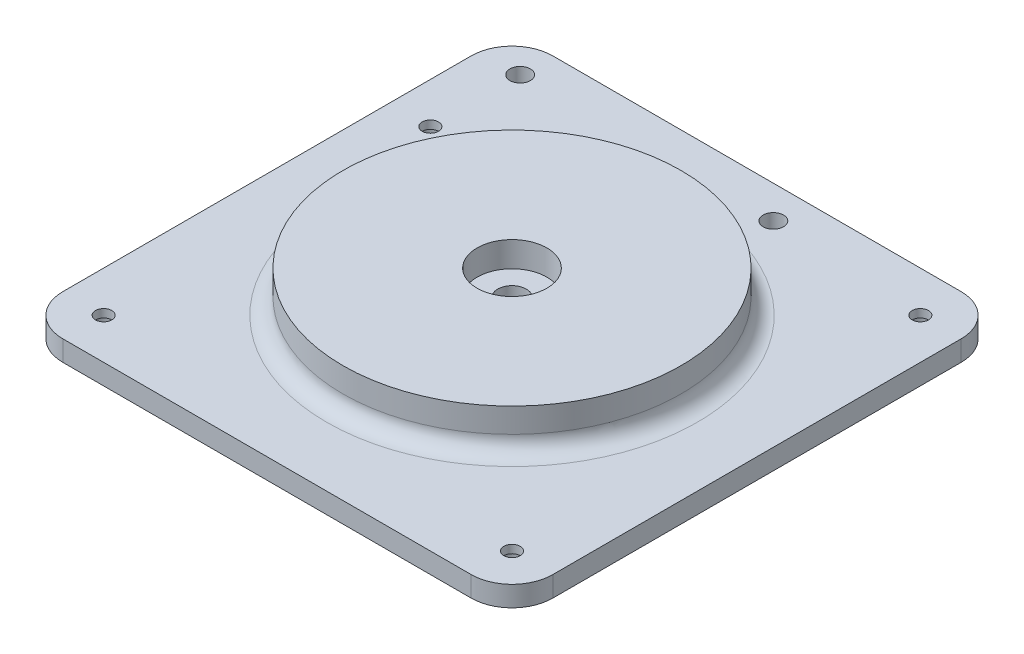
ISO-10303-21;
HEADER;
FILE_DESCRIPTION(('STEP AP214'),'2;1');
FILE_NAME('part.step','',(''),(''),'','','');
FILE_SCHEMA(('AUTOMOTIVE_DESIGN { 1 0 10303 214 1 1 1 1 }'));
ENDSEC;
DATA;
#1=APPLICATION_CONTEXT('core data for automotive mechanical design processes');
#2=APPLICATION_PROTOCOL_DEFINITION('international standard','automotive_design',2000,#1);
#3=PRODUCT_CONTEXT('',#1,'mechanical');
#4=PRODUCT('Part','Part','',(#3));
#5=PRODUCT_RELATED_PRODUCT_CATEGORY('part','',(#4));
#6=PRODUCT_DEFINITION_FORMATION('','',#4);
#7=PRODUCT_DEFINITION_CONTEXT('part definition',#1,'design');
#8=PRODUCT_DEFINITION('design','',#6,#7);
#9=PRODUCT_DEFINITION_SHAPE('','',#8);
#10=(LENGTH_UNIT() NAMED_UNIT(*) SI_UNIT(.MILLI.,.METRE.));
#11=(NAMED_UNIT(*) PLANE_ANGLE_UNIT() SI_UNIT($,.RADIAN.));
#12=(NAMED_UNIT(*) SI_UNIT($,.STERADIAN.) SOLID_ANGLE_UNIT());
#13=UNCERTAINTY_MEASURE_WITH_UNIT(LENGTH_MEASURE(1.E-05),#10,'distance_accuracy_value','');
#14=(GEOMETRIC_REPRESENTATION_CONTEXT(3) GLOBAL_UNCERTAINTY_ASSIGNED_CONTEXT((#13)) GLOBAL_UNIT_ASSIGNED_CONTEXT((#10,
#11,#12)) REPRESENTATION_CONTEXT('',''));
#15=CARTESIAN_POINT('',(0.,0.,0.));
#16=DIRECTION('',(0.,0.,1.));
#17=DIRECTION('',(1.,0.,0.));
#18=AXIS2_PLACEMENT_3D('',#15,#16,#17);
#19=CARTESIAN_POINT('',(0.,-5.,0.));
#20=DIRECTION('',(0.,1.,0.));
#21=DIRECTION('',(0.,0.,1.));
#22=AXIS2_PLACEMENT_3D('',#19,#20,#21);
#23=CYLINDRICAL_SURFACE('',#22,3.5);
#24=CARTESIAN_POINT('',(0.,1.,0.));
#25=DIRECTION('',(0.,-1.,0.));
#26=DIRECTION('',(0.,0.,-1.));
#27=AXIS2_PLACEMENT_3D('',#24,#25,#26);
#28=CIRCLE('',#27,3.5);
#29=CARTESIAN_POINT('',(0.,1.,-3.5));
#30=VERTEX_POINT('',#29);
#31=EDGE_CURVE('E179',#30,#30,#28,.F.);
#32=ORIENTED_EDGE('',*,*,#31,.F.);
#33=EDGE_LOOP('',(#32));
#34=FACE_BOUND('',#33,.T.);
#35=CARTESIAN_POINT('',(0.,3.8,0.));
#36=DIRECTION('',(0.,1.,0.));
#37=DIRECTION('',(0.,0.,1.));
#38=AXIS2_PLACEMENT_3D('',#35,#36,#37);
#39=CIRCLE('',#38,3.5);
#40=CARTESIAN_POINT('',(0.,3.8,3.5));
#41=VERTEX_POINT('',#40);
#42=EDGE_CURVE('E40',#41,#41,#39,.F.);
#43=ORIENTED_EDGE('',*,*,#42,.F.);
#44=EDGE_LOOP('',(#43));
#45=FACE_BOUND('',#44,.T.);
#46=ADVANCED_FACE('F36',(#34,#45),#23,.F.);
#47=CARTESIAN_POINT('',(50.,-5.,50.));
#48=DIRECTION('',(0.,1.,0.));
#49=DIRECTION('',(0.,0.,1.));
#50=AXIS2_PLACEMENT_3D('',#47,#48,#49);
#51=CYLINDRICAL_SURFACE('',#50,10.);
#52=DIRECTION('',(0.,1.,0.));
#53=VECTOR('',#52,1.);
#54=CARTESIAN_POINT('',(50.,-5.,60.));
#55=LINE('',#54,#53);
#56=CARTESIAN_POINT('',(50.,-5.,60.));
#57=VERTEX_POINT('',#56);
#58=CARTESIAN_POINT('',(50.,0.,60.));
#59=VERTEX_POINT('',#58);
#60=EDGE_CURVE('E158',#57,#59,#55,.T.);
#61=ORIENTED_EDGE('',*,*,#60,.F.);
#62=CARTESIAN_POINT('',(50.,-5.,50.));
#63=DIRECTION('',(0.,-1.,0.));
#64=DIRECTION('',(0.,0.,-1.));
#65=AXIS2_PLACEMENT_3D('',#62,#63,#64);
#66=CIRCLE('',#65,10.);
#67=CARTESIAN_POINT('',(60.,-5.,50.));
#68=VERTEX_POINT('',#67);
#69=EDGE_CURVE('E45',#68,#57,#66,.T.);
#70=ORIENTED_EDGE('',*,*,#69,.F.);
#71=DIRECTION('',(0.,1.,0.));
#72=VECTOR('',#71,1.);
#73=CARTESIAN_POINT('',(60.,-5.,50.));
#74=LINE('',#73,#72);
#75=CARTESIAN_POINT('',(60.,0.,50.));
#76=VERTEX_POINT('',#75);
#77=EDGE_CURVE('E161',#76,#68,#74,.F.);
#78=ORIENTED_EDGE('',*,*,#77,.F.);
#79=CARTESIAN_POINT('',(50.,0.,50.));
#80=DIRECTION('',(0.,-1.,0.));
#81=DIRECTION('',(0.,0.,-1.));
#82=AXIS2_PLACEMENT_3D('',#79,#80,#81);
#83=CIRCLE('',#82,10.);
#84=EDGE_CURVE('E11',#59,#76,#83,.F.);
#85=ORIENTED_EDGE('',*,*,#84,.F.);
#86=EDGE_LOOP('',(#61,#70,#78,#85));
#87=FACE_BOUND('',#86,.T.);
#88=ADVANCED_FACE('F38',(#87),#51,.T.);
#89=CARTESIAN_POINT('',(-50.,-5.,50.));
#90=DIRECTION('',(0.,1.,0.));
#91=DIRECTION('',(0.,0.,1.));
#92=AXIS2_PLACEMENT_3D('',#89,#90,#91);
#93=CYLINDRICAL_SURFACE('',#92,10.);
#94=DIRECTION('',(0.,1.,0.));
#95=VECTOR('',#94,1.);
#96=CARTESIAN_POINT('',(-60.,-5.,50.));
#97=LINE('',#96,#95);
#98=CARTESIAN_POINT('',(-60.,-5.,50.));
#99=VERTEX_POINT('',#98);
#100=CARTESIAN_POINT('',(-60.,0.,50.));
#101=VERTEX_POINT('',#100);
#102=EDGE_CURVE('E147',#99,#101,#97,.T.);
#103=ORIENTED_EDGE('',*,*,#102,.F.);
#104=CARTESIAN_POINT('',(-50.,-5.,50.));
#105=DIRECTION('',(0.,-1.,0.));
#106=DIRECTION('',(0.,0.,-1.));
#107=AXIS2_PLACEMENT_3D('',#104,#105,#106);
#108=CIRCLE('',#107,10.);
#109=CARTESIAN_POINT('',(-50.,-5.,60.));
#110=VERTEX_POINT('',#109);
#111=EDGE_CURVE('E153',#110,#99,#108,.T.);
#112=ORIENTED_EDGE('',*,*,#111,.F.);
#113=DIRECTION('',(0.,1.,0.));
#114=VECTOR('',#113,1.);
#115=CARTESIAN_POINT('',(-50.,-5.,60.));
#116=LINE('',#115,#114);
#117=CARTESIAN_POINT('',(-50.,0.,60.));
#118=VERTEX_POINT('',#117);
#119=EDGE_CURVE('E150',#118,#110,#116,.F.);
#120=ORIENTED_EDGE('',*,*,#119,.F.);
#121=CARTESIAN_POINT('',(-50.,0.,50.));
#122=DIRECTION('',(0.,-1.,0.));
#123=DIRECTION('',(0.,0.,-1.));
#124=AXIS2_PLACEMENT_3D('',#121,#122,#123);
#125=CIRCLE('',#124,10.);
#126=EDGE_CURVE('E155',#101,#118,#125,.F.);
#127=ORIENTED_EDGE('',*,*,#126,.F.);
#128=EDGE_LOOP('',(#103,#112,#120,#127));
#129=FACE_BOUND('',#128,.T.);
#130=ADVANCED_FACE('F223',(#129),#93,.T.);
#131=CARTESIAN_POINT('',(-50.,-5.,-50.));
#132=DIRECTION('',(0.,1.,0.));
#133=DIRECTION('',(0.,0.,1.));
#134=AXIS2_PLACEMENT_3D('',#131,#132,#133);
#135=CYLINDRICAL_SURFACE('',#134,10.);
#136=DIRECTION('',(0.,1.,0.));
#137=VECTOR('',#136,1.);
#138=CARTESIAN_POINT('',(-50.,-5.,-60.));
#139=LINE('',#138,#137);
#140=CARTESIAN_POINT('',(-50.,-5.,-60.));
#141=VERTEX_POINT('',#140);
#142=CARTESIAN_POINT('',(-50.,0.,-60.));
#143=VERTEX_POINT('',#142);
#144=EDGE_CURVE('E122',#141,#143,#139,.T.);
#145=ORIENTED_EDGE('',*,*,#144,.F.);
#146=CARTESIAN_POINT('',(-50.,-5.,-50.));
#147=DIRECTION('',(0.,-1.,0.));
#148=DIRECTION('',(0.,0.,-1.));
#149=AXIS2_PLACEMENT_3D('',#146,#147,#148);
#150=CIRCLE('',#149,10.);
#151=CARTESIAN_POINT('',(-60.,-5.,-50.));
#152=VERTEX_POINT('',#151);
#153=EDGE_CURVE('E107',#152,#141,#150,.T.);
#154=ORIENTED_EDGE('',*,*,#153,.F.);
#155=DIRECTION('',(0.,1.,0.));
#156=VECTOR('',#155,1.);
#157=CARTESIAN_POINT('',(-60.,-5.,-50.));
#158=LINE('',#157,#156);
#159=CARTESIAN_POINT('',(-60.,0.,-50.));
#160=VERTEX_POINT('',#159);
#161=EDGE_CURVE('E140',#160,#152,#158,.F.);
#162=ORIENTED_EDGE('',*,*,#161,.F.);
#163=CARTESIAN_POINT('',(-50.,0.,-50.));
#164=DIRECTION('',(0.,-1.,0.));
#165=DIRECTION('',(0.,0.,-1.));
#166=AXIS2_PLACEMENT_3D('',#163,#164,#165);
#167=CIRCLE('',#166,10.);
#168=EDGE_CURVE('E144',#143,#160,#167,.F.);
#169=ORIENTED_EDGE('',*,*,#168,.F.);
#170=EDGE_LOOP('',(#145,#154,#162,#169));
#171=FACE_BOUND('',#170,.T.);
#172=ADVANCED_FACE('F425',(#171),#135,.T.);
#173=CARTESIAN_POINT('',(50.,-5.,-50.));
#174=DIRECTION('',(0.,-1.,0.));
#175=DIRECTION('',(0.,0.,-1.));
#176=AXIS2_PLACEMENT_3D('',#173,#174,#175);
#177=CYLINDRICAL_SURFACE('',#176,10.);
#178=DIRECTION('',(0.,-1.,0.));
#179=VECTOR('',#178,1.);
#180=CARTESIAN_POINT('',(50.,-5.,-60.));
#181=LINE('',#180,#179);
#182=CARTESIAN_POINT('',(50.,0.,-60.));
#183=VERTEX_POINT('',#182);
#184=CARTESIAN_POINT('',(50.,-5.,-60.));
#185=VERTEX_POINT('',#184);
#186=EDGE_CURVE('E118',#183,#185,#181,.T.);
#187=ORIENTED_EDGE('',*,*,#186,.F.);
#188=CARTESIAN_POINT('',(50.,0.,-50.));
#189=DIRECTION('',(0.,-1.,0.));
#190=DIRECTION('',(0.,0.,-1.));
#191=AXIS2_PLACEMENT_3D('',#188,#189,#190);
#192=CIRCLE('',#191,10.);
#193=CARTESIAN_POINT('',(60.,0.,-50.));
#194=VERTEX_POINT('',#193);
#195=EDGE_CURVE('E123',#194,#183,#192,.F.);
#196=ORIENTED_EDGE('',*,*,#195,.F.);
#197=DIRECTION('',(0.,-1.,0.));
#198=VECTOR('',#197,1.);
#199=CARTESIAN_POINT('',(60.,-5.,-50.));
#200=LINE('',#199,#198);
#201=CARTESIAN_POINT('',(60.,-5.,-50.));
#202=VERTEX_POINT('',#201);
#203=EDGE_CURVE('E120',#202,#194,#200,.F.);
#204=ORIENTED_EDGE('',*,*,#203,.F.);
#205=CARTESIAN_POINT('',(50.,-5.,-50.));
#206=DIRECTION('',(0.,-1.,0.));
#207=DIRECTION('',(0.,0.,-1.));
#208=AXIS2_PLACEMENT_3D('',#205,#206,#207);
#209=CIRCLE('',#208,10.);
#210=EDGE_CURVE('E104',#185,#202,#209,.T.);
#211=ORIENTED_EDGE('',*,*,#210,.F.);
#212=EDGE_LOOP('',(#187,#196,#204,#211));
#213=FACE_BOUND('',#212,.T.);
#214=ADVANCED_FACE('F117',(#213),#177,.T.);
#215=CARTESIAN_POINT('',(0.,-5.,0.));
#216=DIRECTION('',(0.,-1.,0.));
#217=DIRECTION('',(0.,0.,-1.));
#218=AXIS2_PLACEMENT_3D('',#215,#216,#217);
#219=PLANE('',#218);
#220=DIRECTION('',(0.,0.,1.));
#221=VECTOR('',#220,1.);
#222=CARTESIAN_POINT('',(60.,-5.,60.));
#223=LINE('',#222,#221);
#224=EDGE_CURVE('E166',#202,#68,#223,.T.);
#225=ORIENTED_EDGE('',*,*,#224,.T.);
#226=ORIENTED_EDGE('',*,*,#69,.T.);
#227=DIRECTION('',(-1.,0.,0.));
#228=VECTOR('',#227,1.);
#229=CARTESIAN_POINT('',(-60.,-5.,60.));
#230=LINE('',#229,#228);
#231=EDGE_CURVE('E164',#57,#110,#230,.T.);
#232=ORIENTED_EDGE('',*,*,#231,.T.);
#233=ORIENTED_EDGE('',*,*,#111,.T.);
#234=DIRECTION('',(0.,0.,-1.));
#235=VECTOR('',#234,1.);
#236=CARTESIAN_POINT('',(-60.,-5.,60.));
#237=LINE('',#236,#235);
#238=EDGE_CURVE('E113',#99,#152,#237,.T.);
#239=ORIENTED_EDGE('',*,*,#238,.T.);
#240=ORIENTED_EDGE('',*,*,#153,.T.);
#241=DIRECTION('',(1.,0.,0.));
#242=VECTOR('',#241,1.);
#243=CARTESIAN_POINT('',(-60.,-5.,-60.));
#244=LINE('',#243,#242);
#245=EDGE_CURVE('E99',#141,#185,#244,.T.);
#246=ORIENTED_EDGE('',*,*,#245,.T.);
#247=ORIENTED_EDGE('',*,*,#210,.T.);
#248=EDGE_LOOP('',(#225,#226,#232,#233,#239,#240,#246,#247));
#249=FACE_BOUND('',#248,.T.);
#250=CARTESIAN_POINT('',(-50.,-5.,-30.));
#251=DIRECTION('',(0.,-1.,0.));
#252=DIRECTION('',(0.,0.,-1.));
#253=AXIS2_PLACEMENT_3D('',#250,#251,#252);
#254=CIRCLE('',#253,3.);
#255=CARTESIAN_POINT('',(-50.,-5.,-33.));
#256=VERTEX_POINT('',#255);
#257=EDGE_CURVE('E568',#256,#256,#254,.T.);
#258=ORIENTED_EDGE('',*,*,#257,.F.);
#259=EDGE_LOOP('',(#258));
#260=FACE_BOUND('',#259,.T.);
#261=CARTESIAN_POINT('',(50.,-5.,-50.));
#262=DIRECTION('',(0.,-1.,0.));
#263=DIRECTION('',(0.,0.,-1.));
#264=AXIS2_PLACEMENT_3D('',#261,#262,#263);
#265=CIRCLE('',#264,3.);
#266=CARTESIAN_POINT('',(50.,-5.,-53.));
#267=VERTEX_POINT('',#266);
#268=EDGE_CURVE('E579',#267,#267,#265,.T.);
#269=ORIENTED_EDGE('',*,*,#268,.F.);
#270=EDGE_LOOP('',(#269));
#271=FACE_BOUND('',#270,.T.);
#272=CARTESIAN_POINT('',(50.,-5.,50.));
#273=DIRECTION('',(0.,-1.,0.));
#274=DIRECTION('',(0.,0.,-1.));
#275=AXIS2_PLACEMENT_3D('',#272,#273,#274);
#276=CIRCLE('',#275,3.);
#277=CARTESIAN_POINT('',(50.,-5.,47.));
#278=VERTEX_POINT('',#277);
#279=EDGE_CURVE('E573',#278,#278,#276,.T.);
#280=ORIENTED_EDGE('',*,*,#279,.F.);
#281=EDGE_LOOP('',(#280));
#282=FACE_BOUND('',#281,.T.);
#283=CARTESIAN_POINT('',(-50.,-5.,50.));
#284=DIRECTION('',(0.,-1.,0.));
#285=DIRECTION('',(0.,0.,-1.));
#286=AXIS2_PLACEMENT_3D('',#283,#284,#285);
#287=CIRCLE('',#286,3.);
#288=CARTESIAN_POINT('',(-50.,-5.,47.));
#289=VERTEX_POINT('',#288);
#290=EDGE_CURVE('E572',#289,#289,#287,.T.);
#291=ORIENTED_EDGE('',*,*,#290,.F.);
#292=EDGE_LOOP('',(#291));
#293=FACE_BOUND('',#292,.T.);
#294=CARTESIAN_POINT('',(0.,-5.,0.));
#295=DIRECTION('',(0.,-1.,0.));
#296=DIRECTION('',(0.,0.,-1.));
#297=AXIS2_PLACEMENT_3D('',#294,#295,#296);
#298=CIRCLE('',#297,8.5);
#299=CARTESIAN_POINT('',(0.,-5.,-8.5));
#300=VERTEX_POINT('',#299);
#301=EDGE_CURVE('E590',#300,#300,#298,.T.);
#302=ORIENTED_EDGE('',*,*,#301,.F.);
#303=EDGE_LOOP('',(#302));
#304=FACE_BOUND('',#303,.T.);
#305=CARTESIAN_POINT('',(-50.,-5.,-52.));
#306=DIRECTION('',(0.,1.,0.));
#307=DIRECTION('',(0.,0.,1.));
#308=AXIS2_PLACEMENT_3D('',#305,#306,#307);
#309=CIRCLE('',#308,2.5);
#310=CARTESIAN_POINT('',(-50.,-5.,-49.5));
#311=VERTEX_POINT('',#310);
#312=EDGE_CURVE('E136',#311,#311,#309,.F.);
#313=ORIENTED_EDGE('',*,*,#312,.F.);
#314=EDGE_LOOP('',(#313));
#315=FACE_BOUND('',#314,.T.);
#316=CARTESIAN_POINT('',(12.,-5.,-52.));
#317=DIRECTION('',(0.,1.,0.));
#318=DIRECTION('',(0.,0.,1.));
#319=AXIS2_PLACEMENT_3D('',#316,#317,#318);
#320=CIRCLE('',#319,2.5);
#321=CARTESIAN_POINT('',(12.,-5.,-49.5));
#322=VERTEX_POINT('',#321);
#323=EDGE_CURVE('E535',#322,#322,#320,.F.);
#324=ORIENTED_EDGE('',*,*,#323,.F.);
#325=EDGE_LOOP('',(#324));
#326=FACE_BOUND('',#325,.T.);
#327=ADVANCED_FACE('F102',(#249,#260,#271,#282,#293,#304,#315,#326),#219,.T.);
#328=CARTESIAN_POINT('',(0.,4.,0.));
#329=DIRECTION('',(0.,-1.,0.));
#330=DIRECTION('',(0.,0.,-1.));
#331=AXIS2_PLACEMENT_3D('',#328,#329,#330);
#332=TOROIDAL_SURFACE('',#331,45.4,4.);
#333=CARTESIAN_POINT('',(0.,0.,0.));
#334=DIRECTION('',(0.,-1.,0.));
#335=DIRECTION('',(0.,0.,-1.));
#336=AXIS2_PLACEMENT_3D('',#333,#334,#335);
#337=CIRCLE('',#336,45.4);
#338=CARTESIAN_POINT('',(0.,0.,-45.4));
#339=VERTEX_POINT('',#338);
#340=EDGE_CURVE('E133',#339,#339,#337,.T.);
#341=ORIENTED_EDGE('',*,*,#340,.F.);
#342=EDGE_LOOP('',(#341));
#343=FACE_BOUND('',#342,.T.);
#344=CARTESIAN_POINT('',(0.,4.,0.));
#345=DIRECTION('',(0.,-1.,0.));
#346=DIRECTION('',(0.,0.,-1.));
#347=AXIS2_PLACEMENT_3D('',#344,#345,#346);
#348=CIRCLE('',#347,41.4);
#349=CARTESIAN_POINT('',(0.,4.,-41.4));
#350=VERTEX_POINT('',#349);
#351=EDGE_CURVE('E129',#350,#350,#348,.F.);
#352=ORIENTED_EDGE('',*,*,#351,.F.);
#353=EDGE_LOOP('',(#352));
#354=FACE_BOUND('',#353,.T.);
#355=ADVANCED_FACE('F194',(#343,#354),#332,.F.);
#356=CARTESIAN_POINT('',(0.,10.,0.));
#357=DIRECTION('',(0.,-1.,0.));
#358=DIRECTION('',(0.,0.,-1.));
#359=AXIS2_PLACEMENT_3D('',#356,#357,#358);
#360=CYLINDRICAL_SURFACE('',#359,41.4);
#361=ORIENTED_EDGE('',*,*,#351,.T.);
#362=EDGE_LOOP('',(#361));
#363=FACE_BOUND('',#362,.T.);
#364=CARTESIAN_POINT('',(0.,10.,0.));
#365=DIRECTION('',(0.,1.,0.));
#366=DIRECTION('',(0.,0.,1.));
#367=AXIS2_PLACEMENT_3D('',#364,#365,#366);
#368=CIRCLE('',#367,41.4);
#369=CARTESIAN_POINT('',(0.,10.,41.4));
#370=VERTEX_POINT('',#369);
#371=EDGE_CURVE('E112',#370,#370,#368,.T.);
#372=ORIENTED_EDGE('',*,*,#371,.F.);
#373=EDGE_LOOP('',(#372));
#374=FACE_BOUND('',#373,.T.);
#375=ADVANCED_FACE('F197',(#363,#374),#360,.T.);
#376=CARTESIAN_POINT('',(0.,10.,0.));
#377=DIRECTION('',(0.,1.,0.));
#378=DIRECTION('',(0.,0.,1.));
#379=AXIS2_PLACEMENT_3D('',#376,#377,#378);
#380=PLANE('',#379);
#381=CARTESIAN_POINT('',(0.,10.,0.));
#382=DIRECTION('',(0.,1.,0.));
#383=DIRECTION('',(0.,0.,1.));
#384=AXIS2_PLACEMENT_3D('',#381,#382,#383);
#385=CIRCLE('',#384,8.55);
#386=CARTESIAN_POINT('',(0.,10.,8.55));
#387=VERTEX_POINT('',#386);
#388=EDGE_CURVE('E531',#387,#387,#385,.T.);
#389=ORIENTED_EDGE('',*,*,#388,.F.);
#390=EDGE_LOOP('',(#389));
#391=FACE_BOUND('',#390,.T.);
#392=ORIENTED_EDGE('',*,*,#371,.T.);
#393=EDGE_LOOP('',(#392));
#394=FACE_BOUND('',#393,.T.);
#395=ADVANCED_FACE('F203',(#391,#394),#380,.T.);
#396=CARTESIAN_POINT('',(60.,-5.,60.));
#397=DIRECTION('',(-1.,0.,0.));
#398=DIRECTION('',(0.,0.,1.));
#399=AXIS2_PLACEMENT_3D('',#396,#397,#398);
#400=PLANE('',#399);
#401=DIRECTION('',(0.,0.,1.));
#402=VECTOR('',#401,1.);
#403=CARTESIAN_POINT('',(60.,0.,60.));
#404=LINE('',#403,#402);
#405=EDGE_CURVE('E175',#194,#76,#404,.T.);
#406=ORIENTED_EDGE('',*,*,#405,.T.);
#407=ORIENTED_EDGE('',*,*,#77,.T.);
#408=ORIENTED_EDGE('',*,*,#224,.F.);
#409=ORIENTED_EDGE('',*,*,#203,.T.);
#410=EDGE_LOOP('',(#406,#407,#408,#409));
#411=FACE_BOUND('',#410,.T.);
#412=ADVANCED_FACE('F208',(#411),#400,.F.);
#413=CARTESIAN_POINT('',(-60.,-5.,60.));
#414=DIRECTION('',(0.,0.,-1.));
#415=DIRECTION('',(-1.,0.,0.));
#416=AXIS2_PLACEMENT_3D('',#413,#414,#415);
#417=PLANE('',#416);
#418=ORIENTED_EDGE('',*,*,#231,.F.);
#419=ORIENTED_EDGE('',*,*,#60,.T.);
#420=DIRECTION('',(-1.,0.,0.));
#421=VECTOR('',#420,1.);
#422=CARTESIAN_POINT('',(-60.,0.,60.));
#423=LINE('',#422,#421);
#424=EDGE_CURVE('E178',#59,#118,#423,.T.);
#425=ORIENTED_EDGE('',*,*,#424,.T.);
#426=ORIENTED_EDGE('',*,*,#119,.T.);
#427=EDGE_LOOP('',(#418,#419,#425,#426));
#428=FACE_BOUND('',#427,.T.);
#429=ADVANCED_FACE('F168',(#428),#417,.F.);
#430=CARTESIAN_POINT('',(-60.,-5.,60.));
#431=DIRECTION('',(1.,0.,0.));
#432=DIRECTION('',(0.,0.,-1.));
#433=AXIS2_PLACEMENT_3D('',#430,#431,#432);
#434=PLANE('',#433);
#435=ORIENTED_EDGE('',*,*,#238,.F.);
#436=ORIENTED_EDGE('',*,*,#102,.T.);
#437=DIRECTION('',(0.,0.,-1.));
#438=VECTOR('',#437,1.);
#439=CARTESIAN_POINT('',(-60.,0.,60.));
#440=LINE('',#439,#438);
#441=EDGE_CURVE('E181',#101,#160,#440,.T.);
#442=ORIENTED_EDGE('',*,*,#441,.T.);
#443=ORIENTED_EDGE('',*,*,#161,.T.);
#444=EDGE_LOOP('',(#435,#436,#442,#443));
#445=FACE_BOUND('',#444,.T.);
#446=ADVANCED_FACE('F238',(#445),#434,.F.);
#447=CARTESIAN_POINT('',(-60.,-5.,-60.));
#448=DIRECTION('',(0.,0.,1.));
#449=DIRECTION('',(1.,0.,0.));
#450=AXIS2_PLACEMENT_3D('',#447,#448,#449);
#451=PLANE('',#450);
#452=ORIENTED_EDGE('',*,*,#245,.F.);
#453=ORIENTED_EDGE('',*,*,#144,.T.);
#454=DIRECTION('',(1.,0.,0.));
#455=VECTOR('',#454,1.);
#456=CARTESIAN_POINT('',(-60.,0.,-60.));
#457=LINE('',#456,#455);
#458=EDGE_CURVE('E127',#143,#183,#457,.T.);
#459=ORIENTED_EDGE('',*,*,#458,.T.);
#460=ORIENTED_EDGE('',*,*,#186,.T.);
#461=EDGE_LOOP('',(#452,#453,#459,#460));
#462=FACE_BOUND('',#461,.T.);
#463=ADVANCED_FACE('F125',(#462),#451,.F.);
#464=CARTESIAN_POINT('',(0.,0.,0.));
#465=DIRECTION('',(0.,-1.,0.));
#466=DIRECTION('',(0.,0.,-1.));
#467=AXIS2_PLACEMENT_3D('',#464,#465,#466);
#468=PLANE('',#467);
#469=CARTESIAN_POINT('',(-50.,0.,-52.));
#470=DIRECTION('',(0.,1.,0.));
#471=DIRECTION('',(0.,0.,1.));
#472=AXIS2_PLACEMENT_3D('',#469,#470,#471);
#473=CIRCLE('',#472,2.5);
#474=CARTESIAN_POINT('',(-50.,0.,-49.5));
#475=VERTEX_POINT('',#474);
#476=EDGE_CURVE('E539',#475,#475,#473,.T.);
#477=ORIENTED_EDGE('',*,*,#476,.F.);
#478=EDGE_LOOP('',(#477));
#479=FACE_BOUND('',#478,.T.);
#480=CARTESIAN_POINT('',(12.,0.,-52.));
#481=DIRECTION('',(0.,1.,0.));
#482=DIRECTION('',(0.,0.,1.));
#483=AXIS2_PLACEMENT_3D('',#480,#481,#482);
#484=CIRCLE('',#483,2.5);
#485=CARTESIAN_POINT('',(12.,0.,-49.5));
#486=VERTEX_POINT('',#485);
#487=EDGE_CURVE('E538',#486,#486,#484,.T.);
#488=ORIENTED_EDGE('',*,*,#487,.F.);
#489=EDGE_LOOP('',(#488));
#490=FACE_BOUND('',#489,.T.);
#491=CARTESIAN_POINT('',(-50.,0.,-30.));
#492=DIRECTION('',(0.,-1.,0.));
#493=DIRECTION('',(0.,0.,-1.));
#494=AXIS2_PLACEMENT_3D('',#491,#492,#493);
#495=CIRCLE('',#494,2.);
#496=CARTESIAN_POINT('',(-50.,0.,-32.));
#497=VERTEX_POINT('',#496);
#498=EDGE_CURVE('E556',#497,#497,#495,.F.);
#499=ORIENTED_EDGE('',*,*,#498,.F.);
#500=EDGE_LOOP('',(#499));
#501=FACE_BOUND('',#500,.T.);
#502=CARTESIAN_POINT('',(50.,0.,-50.));
#503=DIRECTION('',(0.,-1.,0.));
#504=DIRECTION('',(0.,0.,-1.));
#505=AXIS2_PLACEMENT_3D('',#502,#503,#504);
#506=CIRCLE('',#505,2.);
#507=CARTESIAN_POINT('',(50.,0.,-52.));
#508=VERTEX_POINT('',#507);
#509=EDGE_CURVE('E549',#508,#508,#506,.F.);
#510=ORIENTED_EDGE('',*,*,#509,.F.);
#511=EDGE_LOOP('',(#510));
#512=FACE_BOUND('',#511,.T.);
#513=CARTESIAN_POINT('',(50.,0.,50.));
#514=DIRECTION('',(0.,-1.,0.));
#515=DIRECTION('',(0.,0.,-1.));
#516=AXIS2_PLACEMENT_3D('',#513,#514,#515);
#517=CIRCLE('',#516,2.);
#518=CARTESIAN_POINT('',(50.,0.,48.));
#519=VERTEX_POINT('',#518);
#520=EDGE_CURVE('E548',#519,#519,#517,.F.);
#521=ORIENTED_EDGE('',*,*,#520,.F.);
#522=EDGE_LOOP('',(#521));
#523=FACE_BOUND('',#522,.T.);
#524=CARTESIAN_POINT('',(-50.,0.,50.));
#525=DIRECTION('',(0.,-1.,0.));
#526=DIRECTION('',(0.,0.,-1.));
#527=AXIS2_PLACEMENT_3D('',#524,#525,#526);
#528=CIRCLE('',#527,2.);
#529=CARTESIAN_POINT('',(-50.,0.,48.));
#530=VERTEX_POINT('',#529);
#531=EDGE_CURVE('E565',#530,#530,#528,.F.);
#532=ORIENTED_EDGE('',*,*,#531,.F.);
#533=EDGE_LOOP('',(#532));
#534=FACE_BOUND('',#533,.T.);
#535=ORIENTED_EDGE('',*,*,#340,.T.);
#536=EDGE_LOOP('',(#535));
#537=FACE_BOUND('',#536,.T.);
#538=ORIENTED_EDGE('',*,*,#424,.F.);
#539=ORIENTED_EDGE('',*,*,#84,.T.);
#540=ORIENTED_EDGE('',*,*,#405,.F.);
#541=ORIENTED_EDGE('',*,*,#195,.T.);
#542=ORIENTED_EDGE('',*,*,#458,.F.);
#543=ORIENTED_EDGE('',*,*,#168,.T.);
#544=ORIENTED_EDGE('',*,*,#441,.F.);
#545=ORIENTED_EDGE('',*,*,#126,.T.);
#546=EDGE_LOOP('',(#538,#539,#540,#541,#542,#543,#544,#545));
#547=FACE_BOUND('',#546,.T.);
#548=ADVANCED_FACE('F192',(#479,#490,#501,#512,#523,#534,#537,#547),#468,.F.);
#549=CARTESIAN_POINT('',(0.,1.,0.));
#550=DIRECTION('',(0.,-1.,0.));
#551=DIRECTION('',(0.,0.,-1.));
#552=AXIS2_PLACEMENT_3D('',#549,#550,#551);
#553=PLANE('',#552);
#554=CARTESIAN_POINT('',(0.,1.,0.));
#555=DIRECTION('',(0.,-1.,0.));
#556=DIRECTION('',(0.,0.,-1.));
#557=AXIS2_PLACEMENT_3D('',#554,#555,#556);
#558=CIRCLE('',#557,8.5);
#559=CARTESIAN_POINT('',(0.,1.,-8.5));
#560=VERTEX_POINT('',#559);
#561=EDGE_CURVE('E188',#560,#560,#558,.T.);
#562=ORIENTED_EDGE('',*,*,#561,.T.);
#563=EDGE_LOOP('',(#562));
#564=FACE_BOUND('',#563,.T.);
#565=ORIENTED_EDGE('',*,*,#31,.T.);
#566=EDGE_LOOP('',(#565));
#567=FACE_BOUND('',#566,.T.);
#568=ADVANCED_FACE('F234',(#564,#567),#553,.T.);
#569=CARTESIAN_POINT('',(0.,1.,0.));
#570=DIRECTION('',(0.,-1.,0.));
#571=DIRECTION('',(0.,0.,-1.));
#572=AXIS2_PLACEMENT_3D('',#569,#570,#571);
#573=CYLINDRICAL_SURFACE('',#572,8.5);
#574=ORIENTED_EDGE('',*,*,#561,.F.);
#575=EDGE_LOOP('',(#574));
#576=FACE_BOUND('',#575,.T.);
#577=ORIENTED_EDGE('',*,*,#301,.T.);
#578=EDGE_LOOP('',(#577));
#579=FACE_BOUND('',#578,.T.);
#580=ADVANCED_FACE('F228',(#576,#579),#573,.F.);
#581=CARTESIAN_POINT('',(-50.,-2.,50.));
#582=DIRECTION('',(0.,-1.,0.));
#583=DIRECTION('',(0.,0.,-1.));
#584=AXIS2_PLACEMENT_3D('',#581,#582,#583);
#585=CYLINDRICAL_SURFACE('',#584,3.);
#586=CARTESIAN_POINT('',(-50.,-2.,50.));
#587=DIRECTION('',(0.,-1.,0.));
#588=DIRECTION('',(0.,0.,-1.));
#589=AXIS2_PLACEMENT_3D('',#586,#587,#588);
#590=CIRCLE('',#589,3.);
#591=CARTESIAN_POINT('',(-50.,-2.,47.));
#592=VERTEX_POINT('',#591);
#593=EDGE_CURVE('E587',#592,#592,#590,.T.);
#594=ORIENTED_EDGE('',*,*,#593,.F.);
#595=EDGE_LOOP('',(#594));
#596=FACE_BOUND('',#595,.T.);
#597=ORIENTED_EDGE('',*,*,#290,.T.);
#598=EDGE_LOOP('',(#597));
#599=FACE_BOUND('',#598,.T.);
#600=ADVANCED_FACE('F274',(#596,#599),#585,.F.);
#601=CARTESIAN_POINT('',(-50.,-2.,50.));
#602=DIRECTION('',(0.,-1.,0.));
#603=DIRECTION('',(0.,0.,-1.));
#604=AXIS2_PLACEMENT_3D('',#601,#602,#603);
#605=PLANE('',#604);
#606=CARTESIAN_POINT('',(-50.,-2.,50.));
#607=DIRECTION('',(0.,-1.,0.));
#608=DIRECTION('',(0.,0.,-1.));
#609=AXIS2_PLACEMENT_3D('',#606,#607,#608);
#610=CIRCLE('',#609,2.);
#611=CARTESIAN_POINT('',(-50.,-2.,48.));
#612=VERTEX_POINT('',#611);
#613=EDGE_CURVE('E552',#612,#612,#610,.T.);
#614=ORIENTED_EDGE('',*,*,#613,.F.);
#615=EDGE_LOOP('',(#614));
#616=FACE_BOUND('',#615,.T.);
#617=ORIENTED_EDGE('',*,*,#593,.T.);
#618=EDGE_LOOP('',(#617));
#619=FACE_BOUND('',#618,.T.);
#620=ADVANCED_FACE('F282',(#616,#619),#605,.T.);
#621=CARTESIAN_POINT('',(50.,-2.,50.));
#622=DIRECTION('',(0.,-1.,0.));
#623=DIRECTION('',(0.,0.,-1.));
#624=AXIS2_PLACEMENT_3D('',#621,#622,#623);
#625=CYLINDRICAL_SURFACE('',#624,3.);
#626=CARTESIAN_POINT('',(50.,-2.,50.));
#627=DIRECTION('',(0.,-1.,0.));
#628=DIRECTION('',(0.,0.,-1.));
#629=AXIS2_PLACEMENT_3D('',#626,#627,#628);
#630=CIRCLE('',#629,3.);
#631=CARTESIAN_POINT('',(50.,-2.,47.));
#632=VERTEX_POINT('',#631);
#633=EDGE_CURVE('E569',#632,#632,#630,.T.);
#634=ORIENTED_EDGE('',*,*,#633,.F.);
#635=EDGE_LOOP('',(#634));
#636=FACE_BOUND('',#635,.T.);
#637=ORIENTED_EDGE('',*,*,#279,.T.);
#638=EDGE_LOOP('',(#637));
#639=FACE_BOUND('',#638,.T.);
#640=ADVANCED_FACE('F292',(#636,#639),#625,.F.);
#641=CARTESIAN_POINT('',(50.,-2.,50.));
#642=DIRECTION('',(0.,-1.,0.));
#643=DIRECTION('',(0.,0.,-1.));
#644=AXIS2_PLACEMENT_3D('',#641,#642,#643);
#645=PLANE('',#644);
#646=CARTESIAN_POINT('',(50.,-2.,50.));
#647=DIRECTION('',(0.,-1.,0.));
#648=DIRECTION('',(0.,0.,-1.));
#649=AXIS2_PLACEMENT_3D('',#646,#647,#648);
#650=CIRCLE('',#649,2.);
#651=CARTESIAN_POINT('',(50.,-2.,48.));
#652=VERTEX_POINT('',#651);
#653=EDGE_CURVE('E545',#652,#652,#650,.T.);
#654=ORIENTED_EDGE('',*,*,#653,.F.);
#655=EDGE_LOOP('',(#654));
#656=FACE_BOUND('',#655,.T.);
#657=ORIENTED_EDGE('',*,*,#633,.T.);
#658=EDGE_LOOP('',(#657));
#659=FACE_BOUND('',#658,.T.);
#660=ADVANCED_FACE('F301',(#656,#659),#645,.T.);
#661=CARTESIAN_POINT('',(50.,-2.,-50.));
#662=DIRECTION('',(0.,-1.,0.));
#663=DIRECTION('',(0.,0.,-1.));
#664=AXIS2_PLACEMENT_3D('',#661,#662,#663);
#665=CYLINDRICAL_SURFACE('',#664,3.);
#666=CARTESIAN_POINT('',(50.,-2.,-50.));
#667=DIRECTION('',(0.,-1.,0.));
#668=DIRECTION('',(0.,0.,-1.));
#669=AXIS2_PLACEMENT_3D('',#666,#667,#668);
#670=CIRCLE('',#669,3.);
#671=CARTESIAN_POINT('',(50.,-2.,-53.));
#672=VERTEX_POINT('',#671);
#673=EDGE_CURVE('E576',#672,#672,#670,.T.);
#674=ORIENTED_EDGE('',*,*,#673,.F.);
#675=EDGE_LOOP('',(#674));
#676=FACE_BOUND('',#675,.T.);
#677=ORIENTED_EDGE('',*,*,#268,.T.);
#678=EDGE_LOOP('',(#677));
#679=FACE_BOUND('',#678,.T.);
#680=ADVANCED_FACE('F309',(#676,#679),#665,.F.);
#681=CARTESIAN_POINT('',(50.,-2.,-50.));
#682=DIRECTION('',(0.,-1.,0.));
#683=DIRECTION('',(0.,0.,-1.));
#684=AXIS2_PLACEMENT_3D('',#681,#682,#683);
#685=PLANE('',#684);
#686=CARTESIAN_POINT('',(50.,-2.,-50.));
#687=DIRECTION('',(0.,-1.,0.));
#688=DIRECTION('',(0.,0.,-1.));
#689=AXIS2_PLACEMENT_3D('',#686,#687,#688);
#690=CIRCLE('',#689,2.);
#691=CARTESIAN_POINT('',(50.,-2.,-52.));
#692=VERTEX_POINT('',#691);
#693=EDGE_CURVE('E553',#692,#692,#690,.T.);
#694=ORIENTED_EDGE('',*,*,#693,.F.);
#695=EDGE_LOOP('',(#694));
#696=FACE_BOUND('',#695,.T.);
#697=ORIENTED_EDGE('',*,*,#673,.T.);
#698=EDGE_LOOP('',(#697));
#699=FACE_BOUND('',#698,.T.);
#700=ADVANCED_FACE('F317',(#696,#699),#685,.T.);
#701=CARTESIAN_POINT('',(-50.,-2.,-30.));
#702=DIRECTION('',(0.,-1.,0.));
#703=DIRECTION('',(0.,0.,-1.));
#704=AXIS2_PLACEMENT_3D('',#701,#702,#703);
#705=CYLINDRICAL_SURFACE('',#704,3.);
#706=CARTESIAN_POINT('',(-50.,-2.,-30.));
#707=DIRECTION('',(0.,-1.,0.));
#708=DIRECTION('',(0.,0.,-1.));
#709=AXIS2_PLACEMENT_3D('',#706,#707,#708);
#710=CIRCLE('',#709,3.);
#711=CARTESIAN_POINT('',(-50.,-2.,-33.));
#712=VERTEX_POINT('',#711);
#713=EDGE_CURVE('E582',#712,#712,#710,.T.);
#714=ORIENTED_EDGE('',*,*,#713,.F.);
#715=EDGE_LOOP('',(#714));
#716=FACE_BOUND('',#715,.T.);
#717=ORIENTED_EDGE('',*,*,#257,.T.);
#718=EDGE_LOOP('',(#717));
#719=FACE_BOUND('',#718,.T.);
#720=ADVANCED_FACE('F324',(#716,#719),#705,.F.);
#721=CARTESIAN_POINT('',(-50.,-2.,-30.));
#722=DIRECTION('',(0.,-1.,0.));
#723=DIRECTION('',(0.,0.,-1.));
#724=AXIS2_PLACEMENT_3D('',#721,#722,#723);
#725=PLANE('',#724);
#726=CARTESIAN_POINT('',(-50.,-2.,-30.));
#727=DIRECTION('',(0.,-1.,0.));
#728=DIRECTION('',(0.,0.,-1.));
#729=AXIS2_PLACEMENT_3D('',#726,#727,#728);
#730=CIRCLE('',#729,2.);
#731=CARTESIAN_POINT('',(-50.,-2.,-32.));
#732=VERTEX_POINT('',#731);
#733=EDGE_CURVE('E542',#732,#732,#730,.T.);
#734=ORIENTED_EDGE('',*,*,#733,.F.);
#735=EDGE_LOOP('',(#734));
#736=FACE_BOUND('',#735,.T.);
#737=ORIENTED_EDGE('',*,*,#713,.T.);
#738=EDGE_LOOP('',(#737));
#739=FACE_BOUND('',#738,.T.);
#740=ADVANCED_FACE('F332',(#736,#739),#725,.T.);
#741=CARTESIAN_POINT('',(-50.,10.001,50.));
#742=DIRECTION('',(0.,-1.,0.));
#743=DIRECTION('',(0.,0.,-1.));
#744=AXIS2_PLACEMENT_3D('',#741,#742,#743);
#745=CYLINDRICAL_SURFACE('',#744,2.);
#746=ORIENTED_EDGE('',*,*,#613,.T.);
#747=EDGE_LOOP('',(#746));
#748=FACE_BOUND('',#747,.T.);
#749=ORIENTED_EDGE('',*,*,#531,.T.);
#750=EDGE_LOOP('',(#749));
#751=FACE_BOUND('',#750,.T.);
#752=ADVANCED_FACE('F339',(#748,#751),#745,.F.);
#753=CARTESIAN_POINT('',(50.,10.001,50.));
#754=DIRECTION('',(0.,-1.,0.));
#755=DIRECTION('',(0.,0.,-1.));
#756=AXIS2_PLACEMENT_3D('',#753,#754,#755);
#757=CYLINDRICAL_SURFACE('',#756,2.);
#758=ORIENTED_EDGE('',*,*,#653,.T.);
#759=EDGE_LOOP('',(#758));
#760=FACE_BOUND('',#759,.T.);
#761=ORIENTED_EDGE('',*,*,#520,.T.);
#762=EDGE_LOOP('',(#761));
#763=FACE_BOUND('',#762,.T.);
#764=ADVANCED_FACE('F347',(#760,#763),#757,.F.);
#765=CARTESIAN_POINT('',(50.,10.001,-50.));
#766=DIRECTION('',(0.,-1.,0.));
#767=DIRECTION('',(0.,0.,-1.));
#768=AXIS2_PLACEMENT_3D('',#765,#766,#767);
#769=CYLINDRICAL_SURFACE('',#768,2.);
#770=ORIENTED_EDGE('',*,*,#693,.T.);
#771=EDGE_LOOP('',(#770));
#772=FACE_BOUND('',#771,.T.);
#773=ORIENTED_EDGE('',*,*,#509,.T.);
#774=EDGE_LOOP('',(#773));
#775=FACE_BOUND('',#774,.T.);
#776=ADVANCED_FACE('F355',(#772,#775),#769,.F.);
#777=CARTESIAN_POINT('',(-50.,10.001,-30.));
#778=DIRECTION('',(0.,-1.,0.));
#779=DIRECTION('',(0.,0.,-1.));
#780=AXIS2_PLACEMENT_3D('',#777,#778,#779);
#781=CYLINDRICAL_SURFACE('',#780,2.);
#782=ORIENTED_EDGE('',*,*,#733,.T.);
#783=EDGE_LOOP('',(#782));
#784=FACE_BOUND('',#783,.T.);
#785=ORIENTED_EDGE('',*,*,#498,.T.);
#786=EDGE_LOOP('',(#785));
#787=FACE_BOUND('',#786,.T.);
#788=ADVANCED_FACE('F363',(#784,#787),#781,.F.);
#789=CARTESIAN_POINT('',(12.,-10.,-52.));
#790=DIRECTION('',(0.,1.,0.));
#791=DIRECTION('',(0.,0.,1.));
#792=AXIS2_PLACEMENT_3D('',#789,#790,#791);
#793=CYLINDRICAL_SURFACE('',#792,2.5);
#794=ORIENTED_EDGE('',*,*,#323,.T.);
#795=EDGE_LOOP('',(#794));
#796=FACE_BOUND('',#795,.T.);
#797=ORIENTED_EDGE('',*,*,#487,.T.);
#798=EDGE_LOOP('',(#797));
#799=FACE_BOUND('',#798,.T.);
#800=ADVANCED_FACE('F371',(#796,#799),#793,.F.);
#801=CARTESIAN_POINT('',(-50.,-10.,-52.));
#802=DIRECTION('',(0.,1.,0.));
#803=DIRECTION('',(0.,0.,1.));
#804=AXIS2_PLACEMENT_3D('',#801,#802,#803);
#805=CYLINDRICAL_SURFACE('',#804,2.5);
#806=ORIENTED_EDGE('',*,*,#312,.T.);
#807=EDGE_LOOP('',(#806));
#808=FACE_BOUND('',#807,.T.);
#809=ORIENTED_EDGE('',*,*,#476,.T.);
#810=EDGE_LOOP('',(#809));
#811=FACE_BOUND('',#810,.T.);
#812=ADVANCED_FACE('F379',(#808,#811),#805,.F.);
#813=CARTESIAN_POINT('',(0.,3.8,0.));
#814=DIRECTION('',(0.,1.,0.));
#815=DIRECTION('',(0.,0.,1.));
#816=AXIS2_PLACEMENT_3D('',#813,#814,#815);
#817=PLANE('',#816);
#818=CARTESIAN_POINT('',(0.,3.8,0.));
#819=DIRECTION('',(0.,1.,0.));
#820=DIRECTION('',(0.,0.,1.));
#821=AXIS2_PLACEMENT_3D('',#818,#819,#820);
#822=CIRCLE('',#821,8.55);
#823=CARTESIAN_POINT('',(0.,3.8,8.55));
#824=VERTEX_POINT('',#823);
#825=EDGE_CURVE('E529',#824,#824,#822,.T.);
#826=ORIENTED_EDGE('',*,*,#825,.T.);
#827=EDGE_LOOP('',(#826));
#828=FACE_BOUND('',#827,.T.);
#829=ORIENTED_EDGE('',*,*,#42,.T.);
#830=EDGE_LOOP('',(#829));
#831=FACE_BOUND('',#830,.T.);
#832=ADVANCED_FACE('F387',(#828,#831),#817,.T.);
#833=CARTESIAN_POINT('',(0.,3.8,0.));
#834=DIRECTION('',(0.,1.,0.));
#835=DIRECTION('',(0.,0.,1.));
#836=AXIS2_PLACEMENT_3D('',#833,#834,#835);
#837=CYLINDRICAL_SURFACE('',#836,8.55);
#838=CARTESIAN_POINT('',(0.,3.8,8.55));
#839=CARTESIAN_POINT('',(0.,3.86458333333333,8.55));
#840=CARTESIAN_POINT('',(0.,3.92916666666667,8.55));
#841=CARTESIAN_POINT('',(0.,4.05833333333333,8.55));
#842=CARTESIAN_POINT('',(0.,4.12291666666667,8.55));
#843=CARTESIAN_POINT('',(0.,4.25208333333333,8.55));
#844=CARTESIAN_POINT('',(0.,4.31666666666667,8.55));
#845=CARTESIAN_POINT('',(0.,4.44583333333333,8.55));
#846=CARTESIAN_POINT('',(0.,4.51041666666667,8.55));
#847=CARTESIAN_POINT('',(0.,4.63958333333333,8.55));
#848=CARTESIAN_POINT('',(0.,4.70416666666667,8.55));
#849=CARTESIAN_POINT('',(0.,4.83333333333333,8.55));
#850=CARTESIAN_POINT('',(0.,4.89791666666667,8.55));
#851=CARTESIAN_POINT('',(0.,5.02708333333333,8.55));
#852=CARTESIAN_POINT('',(0.,5.09166666666667,8.55));
#853=CARTESIAN_POINT('',(0.,5.22083333333333,8.55));
#854=CARTESIAN_POINT('',(0.,5.28541666666667,8.55));
#855=CARTESIAN_POINT('',(0.,5.41458333333333,8.55));
#856=CARTESIAN_POINT('',(0.,5.47916666666667,8.55));
#857=CARTESIAN_POINT('',(0.,5.60833333333333,8.55));
#858=CARTESIAN_POINT('',(0.,5.67291666666667,8.55));
#859=CARTESIAN_POINT('',(0.,5.80208333333333,8.55));
#860=CARTESIAN_POINT('',(0.,5.86666666666667,8.55));
#861=CARTESIAN_POINT('',(0.,5.99583333333333,8.55));
#862=CARTESIAN_POINT('',(0.,6.06041666666667,8.55));
#863=CARTESIAN_POINT('',(0.,6.18958333333333,8.55));
#864=CARTESIAN_POINT('',(0.,6.25416666666667,8.55));
#865=CARTESIAN_POINT('',(0.,6.38333333333333,8.55));
#866=CARTESIAN_POINT('',(0.,6.44791666666667,8.55));
#867=CARTESIAN_POINT('',(0.,6.57708333333333,8.55));
#868=CARTESIAN_POINT('',(0.,6.64166666666667,8.55));
#869=CARTESIAN_POINT('',(0.,6.77083333333333,8.55));
#870=CARTESIAN_POINT('',(0.,6.83541666666667,8.55));
#871=CARTESIAN_POINT('',(0.,6.96458333333333,8.55));
#872=CARTESIAN_POINT('',(0.,7.02916666666667,8.55));
#873=CARTESIAN_POINT('',(0.,7.15833333333333,8.55));
#874=CARTESIAN_POINT('',(0.,7.22291666666667,8.55));
#875=CARTESIAN_POINT('',(0.,7.35208333333333,8.55));
#876=CARTESIAN_POINT('',(0.,7.41666666666667,8.55));
#877=CARTESIAN_POINT('',(0.,7.54583333333333,8.55));
#878=CARTESIAN_POINT('',(0.,7.61041666666667,8.55));
#879=CARTESIAN_POINT('',(0.,7.73958333333333,8.55));
#880=CARTESIAN_POINT('',(0.,7.80416666666667,8.55));
#881=CARTESIAN_POINT('',(0.,7.93333333333333,8.55));
#882=CARTESIAN_POINT('',(0.,7.99791666666667,8.55));
#883=CARTESIAN_POINT('',(0.,8.12708333333333,8.55));
#884=CARTESIAN_POINT('',(0.,8.19166666666667,8.55));
#885=CARTESIAN_POINT('',(0.,8.32083333333333,8.55));
#886=CARTESIAN_POINT('',(0.,8.38541666666667,8.55));
#887=CARTESIAN_POINT('',(0.,8.51458333333333,8.55));
#888=CARTESIAN_POINT('',(0.,8.57916666666667,8.55));
#889=CARTESIAN_POINT('',(0.,8.70833333333333,8.55));
#890=CARTESIAN_POINT('',(0.,8.77291666666667,8.55));
#891=CARTESIAN_POINT('',(0.,8.90208333333333,8.55));
#892=CARTESIAN_POINT('',(0.,8.96666666666667,8.55));
#893=CARTESIAN_POINT('',(0.,9.09583333333333,8.55));
#894=CARTESIAN_POINT('',(0.,9.16041666666667,8.55));
#895=CARTESIAN_POINT('',(0.,9.28958333333333,8.55));
#896=CARTESIAN_POINT('',(0.,9.35416666666667,8.55));
#897=CARTESIAN_POINT('',(0.,9.48333333333333,8.55));
#898=CARTESIAN_POINT('',(0.,9.54791666666667,8.55));
#899=CARTESIAN_POINT('',(0.,9.67708333333333,8.55));
#900=CARTESIAN_POINT('',(0.,9.74166666666667,8.55));
#901=CARTESIAN_POINT('',(0.,9.87083333333333,8.55));
#902=CARTESIAN_POINT('',(0.,9.93541666666667,8.55));
#903=CARTESIAN_POINT('',(0.,10.,8.55));
#904=B_SPLINE_CURVE_WITH_KNOTS('',3,(#838,#839,#840,#841,#842,#843,#844,#845,#846,#847,#848,
#849,#850,#851,#852,#853,#854,#855,#856,#857,#858,#859,#860,#861,#862,#863,#864,#865,#866,#867,
#868,#869,#870,#871,#872,#873,#874,#875,#876,#877,#878,#879,#880,#881,#882,#883,#884,#885,#886,
#887,#888,#889,#890,#891,#892,#893,#894,#895,#896,#897,#898,#899,#900,#901,#902,#903),
.UNSPECIFIED.,.F.,.F.,(4,2,2,2,2,2,2,2,2,2,2,2,2,2,2,2,2,2,2,2,2,2,2,2,2,2,2,2,2,2,2,2,4),(0.,
0.193749999999999,0.3875,0.581249999999999,0.775,0.96875,1.1625,1.35625,1.55,1.74375,1.9375,
2.13125,2.325,2.51875,2.7125,2.90625,3.1,3.29375,3.4875,3.68125,3.875,4.06875,4.2625,4.45625,
4.65,4.84375,5.0375,5.23125,5.425,5.61875,5.8125,6.00625,6.2),.UNSPECIFIED.);
#905=EDGE_CURVE('BSEAM396',#824,#387,#904,.T.);
#906=ORIENTED_EDGE('',*,*,#825,.F.);
#907=ORIENTED_EDGE('',*,*,#388,.T.);
#908=ORIENTED_EDGE('',*,*,#905,.T.);
#909=ORIENTED_EDGE('',*,*,#905,.F.);
#910=EDGE_LOOP('',(#906,#908,#907,#909));
#911=FACE_BOUND('',#910,.T.);
#912=ADVANCED_FACE('F396',(#911),#837,.F.);
#913=CLOSED_SHELL('',(#46,#88,#130,#172,#214,#327,#355,#375,#395,#412,#429,#446,#463,#548,#568,
#580,#600,#620,#640,#660,#680,#700,#720,#740,#752,#764,#776,#788,#800,#812,#832,#912));
#914=MANIFOLD_SOLID_BREP('B2',#913);
#915=ADVANCED_BREP_SHAPE_REPRESENTATION('',(#18,#914),#14);
#916=SHAPE_DEFINITION_REPRESENTATION(#9,#915);
ENDSEC;
END-ISO-10303-21;
